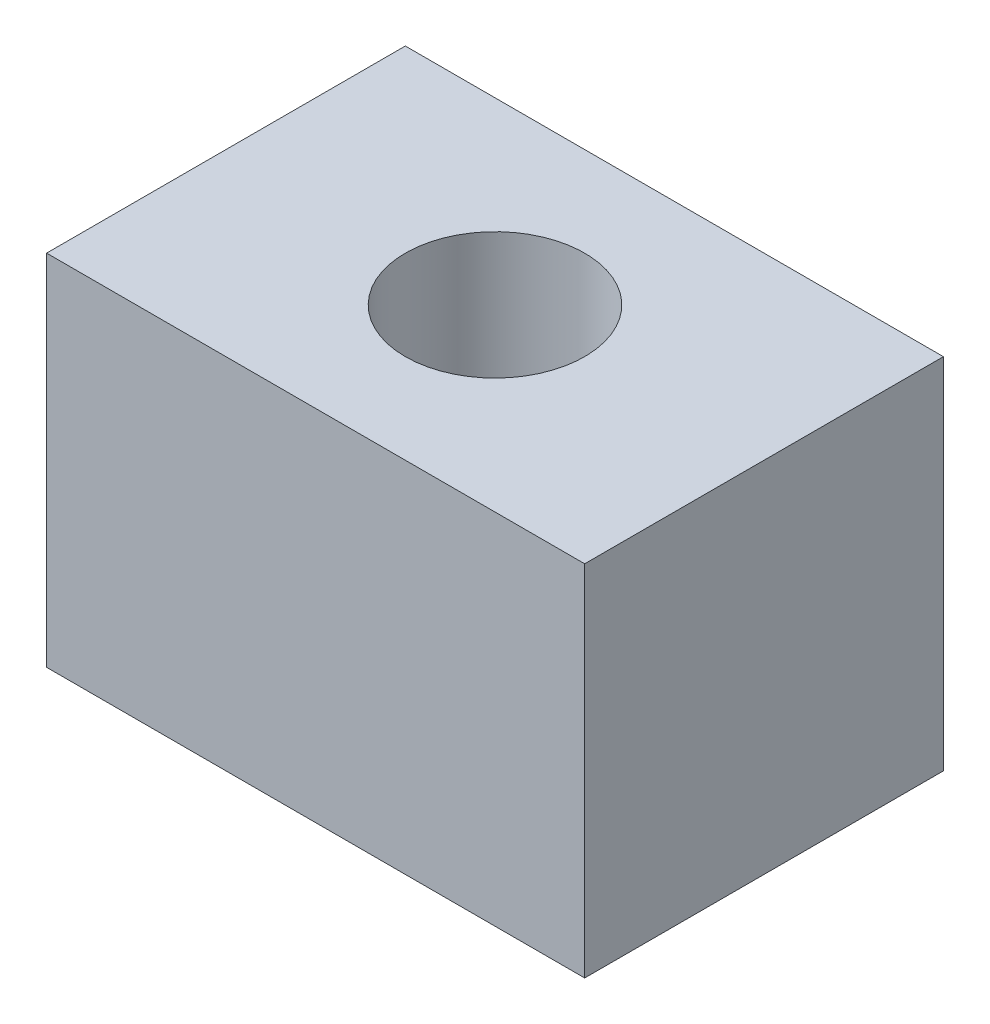
ISO-10303-21;
HEADER;
FILE_DESCRIPTION(('STEP AP214'),'2;1');
FILE_NAME('part.step','',(''),(''),'','','');
FILE_SCHEMA(('AUTOMOTIVE_DESIGN { 1 0 10303 214 1 1 1 1 }'));
ENDSEC;
DATA;
#1=APPLICATION_CONTEXT('core data for automotive mechanical design processes');
#2=APPLICATION_PROTOCOL_DEFINITION('international standard','automotive_design',2000,#1);
#3=PRODUCT_CONTEXT('',#1,'mechanical');
#4=PRODUCT('Part','Part','',(#3));
#5=PRODUCT_RELATED_PRODUCT_CATEGORY('part','',(#4));
#6=PRODUCT_DEFINITION_FORMATION('','',#4);
#7=PRODUCT_DEFINITION_CONTEXT('part definition',#1,'design');
#8=PRODUCT_DEFINITION('design','',#6,#7);
#9=PRODUCT_DEFINITION_SHAPE('','',#8);
#10=(LENGTH_UNIT() NAMED_UNIT(*) SI_UNIT(.MILLI.,.METRE.));
#11=(NAMED_UNIT(*) PLANE_ANGLE_UNIT() SI_UNIT($,.RADIAN.));
#12=(NAMED_UNIT(*) SI_UNIT($,.STERADIAN.) SOLID_ANGLE_UNIT());
#13=UNCERTAINTY_MEASURE_WITH_UNIT(LENGTH_MEASURE(1.E-05),#10,'distance_accuracy_value','');
#14=(GEOMETRIC_REPRESENTATION_CONTEXT(3) GLOBAL_UNCERTAINTY_ASSIGNED_CONTEXT((#13)) GLOBAL_UNIT_ASSIGNED_CONTEXT((#10,
#11,#12)) REPRESENTATION_CONTEXT('',''));
#15=CARTESIAN_POINT('',(0.,0.,0.));
#16=DIRECTION('',(0.,0.,1.));
#17=DIRECTION('',(1.,0.,0.));
#18=AXIS2_PLACEMENT_3D('',#15,#16,#17);
#19=CARTESIAN_POINT('',(0.,6.,0.));
#20=DIRECTION('',(0.,-1.,0.));
#21=DIRECTION('',(0.,0.,-1.));
#22=AXIS2_PLACEMENT_3D('',#19,#20,#21);
#23=PLANE('',#22);
#24=DIRECTION('',(0.,0.,-1.));
#25=VECTOR('',#24,1.);
#26=CARTESIAN_POINT('',(4.5,6.,3.));
#27=LINE('',#26,#25);
#28=CARTESIAN_POINT('',(4.5,6.,3.));
#29=VERTEX_POINT('',#28);
#30=CARTESIAN_POINT('',(4.5,6.,-3.));
#31=VERTEX_POINT('',#30);
#32=EDGE_CURVE('E85',#29,#31,#27,.T.);
#33=ORIENTED_EDGE('',*,*,#32,.T.);
#34=DIRECTION('',(-1.,0.,0.));
#35=VECTOR('',#34,1.);
#36=CARTESIAN_POINT('',(-4.5,6.,-3.));
#37=LINE('',#36,#35);
#38=CARTESIAN_POINT('',(-4.5,6.,-3.));
#39=VERTEX_POINT('',#38);
#40=EDGE_CURVE('E80',#31,#39,#37,.T.);
#41=ORIENTED_EDGE('',*,*,#40,.T.);
#42=DIRECTION('',(0.,0.,1.));
#43=VECTOR('',#42,1.);
#44=CARTESIAN_POINT('',(-4.5,6.,3.));
#45=LINE('',#44,#43);
#46=CARTESIAN_POINT('',(-4.5,6.,3.));
#47=VERTEX_POINT('',#46);
#48=EDGE_CURVE('E83',#39,#47,#45,.T.);
#49=ORIENTED_EDGE('',*,*,#48,.T.);
#50=DIRECTION('',(1.,0.,0.));
#51=VECTOR('',#50,1.);
#52=CARTESIAN_POINT('',(-4.5,6.,3.));
#53=LINE('',#52,#51);
#54=EDGE_CURVE('E50',#47,#29,#53,.T.);
#55=ORIENTED_EDGE('',*,*,#54,.T.);
#56=EDGE_LOOP('',(#33,#41,#49,#55));
#57=FACE_BOUND('',#56,.T.);
#58=CARTESIAN_POINT('',(0.,6.,0.));
#59=DIRECTION('',(0.,1.,0.));
#60=DIRECTION('',(0.,0.,1.));
#61=AXIS2_PLACEMENT_3D('',#58,#59,#60);
#62=CIRCLE('',#61,1.5);
#63=CARTESIAN_POINT('',(0.,6.,1.5));
#64=VERTEX_POINT('',#63);
#65=EDGE_CURVE('E100',#64,#64,#62,.T.);
#66=ORIENTED_EDGE('',*,*,#65,.F.);
#67=EDGE_LOOP('',(#66));
#68=FACE_BOUND('',#67,.T.);
#69=ADVANCED_FACE('F33',(#57,#68),#23,.F.);
#70=CARTESIAN_POINT('',(0.,0.,0.));
#71=DIRECTION('',(0.,-1.,0.));
#72=DIRECTION('',(0.,0.,-1.));
#73=AXIS2_PLACEMENT_3D('',#70,#71,#72);
#74=PLANE('',#73);
#75=DIRECTION('',(0.,0.,-1.));
#76=VECTOR('',#75,1.);
#77=CARTESIAN_POINT('',(4.5,0.,3.));
#78=LINE('',#77,#76);
#79=CARTESIAN_POINT('',(4.5,0.,3.));
#80=VERTEX_POINT('',#79);
#81=CARTESIAN_POINT('',(4.5,0.,-3.));
#82=VERTEX_POINT('',#81);
#83=EDGE_CURVE('E97',#80,#82,#78,.T.);
#84=ORIENTED_EDGE('',*,*,#83,.F.);
#85=DIRECTION('',(1.,0.,0.));
#86=VECTOR('',#85,1.);
#87=CARTESIAN_POINT('',(-4.5,0.,3.));
#88=LINE('',#87,#86);
#89=CARTESIAN_POINT('',(-4.5,0.,3.));
#90=VERTEX_POINT('',#89);
#91=EDGE_CURVE('E73',#90,#80,#88,.T.);
#92=ORIENTED_EDGE('',*,*,#91,.F.);
#93=DIRECTION('',(0.,0.,1.));
#94=VECTOR('',#93,1.);
#95=CARTESIAN_POINT('',(-4.5,0.,3.));
#96=LINE('',#95,#94);
#97=CARTESIAN_POINT('',(-4.5,0.,-3.));
#98=VERTEX_POINT('',#97);
#99=EDGE_CURVE('E67',#98,#90,#96,.T.);
#100=ORIENTED_EDGE('',*,*,#99,.F.);
#101=DIRECTION('',(-1.,0.,0.));
#102=VECTOR('',#101,1.);
#103=CARTESIAN_POINT('',(-4.5,0.,-3.));
#104=LINE('',#103,#102);
#105=EDGE_CURVE('E89',#82,#98,#104,.T.);
#106=ORIENTED_EDGE('',*,*,#105,.F.);
#107=EDGE_LOOP('',(#84,#92,#100,#106));
#108=FACE_BOUND('',#107,.T.);
#109=CARTESIAN_POINT('',(0.,0.,0.));
#110=DIRECTION('',(0.,1.,0.));
#111=DIRECTION('',(0.,0.,1.));
#112=AXIS2_PLACEMENT_3D('',#109,#110,#111);
#113=CIRCLE('',#112,1.5);
#114=CARTESIAN_POINT('',(0.,0.,1.5));
#115=VERTEX_POINT('',#114);
#116=EDGE_CURVE('E112',#115,#115,#113,.T.);
#117=ORIENTED_EDGE('',*,*,#116,.T.);
#118=EDGE_LOOP('',(#117));
#119=FACE_BOUND('',#118,.T.);
#120=ADVANCED_FACE('F108',(#108,#119),#74,.T.);
#121=CARTESIAN_POINT('',(4.5,6.,3.));
#122=DIRECTION('',(-1.,0.,0.));
#123=DIRECTION('',(0.,0.,1.));
#124=AXIS2_PLACEMENT_3D('',#121,#122,#123);
#125=PLANE('',#124);
#126=ORIENTED_EDGE('',*,*,#83,.T.);
#127=DIRECTION('',(0.,-1.,0.));
#128=VECTOR('',#127,1.);
#129=CARTESIAN_POINT('',(4.5,6.,-3.));
#130=LINE('',#129,#128);
#131=EDGE_CURVE('E11',#31,#82,#130,.T.);
#132=ORIENTED_EDGE('',*,*,#131,.F.);
#133=ORIENTED_EDGE('',*,*,#32,.F.);
#134=DIRECTION('',(0.,-1.,0.));
#135=VECTOR('',#134,1.);
#136=CARTESIAN_POINT('',(4.5,6.,3.));
#137=LINE('',#136,#135);
#138=EDGE_CURVE('E93',#29,#80,#137,.T.);
#139=ORIENTED_EDGE('',*,*,#138,.T.);
#140=EDGE_LOOP('',(#126,#132,#133,#139));
#141=FACE_BOUND('',#140,.T.);
#142=ADVANCED_FACE('F35',(#141),#125,.F.);
#143=CARTESIAN_POINT('',(-4.5,6.,-3.));
#144=DIRECTION('',(0.,0.,1.));
#145=DIRECTION('',(1.,0.,0.));
#146=AXIS2_PLACEMENT_3D('',#143,#144,#145);
#147=PLANE('',#146);
#148=ORIENTED_EDGE('',*,*,#105,.T.);
#149=DIRECTION('',(0.,-1.,0.));
#150=VECTOR('',#149,1.);
#151=CARTESIAN_POINT('',(-4.5,6.,-3.));
#152=LINE('',#151,#150);
#153=EDGE_CURVE('E42',#39,#98,#152,.T.);
#154=ORIENTED_EDGE('',*,*,#153,.F.);
#155=ORIENTED_EDGE('',*,*,#40,.F.);
#156=ORIENTED_EDGE('',*,*,#131,.T.);
#157=EDGE_LOOP('',(#148,#154,#155,#156));
#158=FACE_BOUND('',#157,.T.);
#159=ADVANCED_FACE('F88',(#158),#147,.F.);
#160=CARTESIAN_POINT('',(-4.5,6.,3.));
#161=DIRECTION('',(1.,0.,0.));
#162=DIRECTION('',(0.,0.,-1.));
#163=AXIS2_PLACEMENT_3D('',#160,#161,#162);
#164=PLANE('',#163);
#165=ORIENTED_EDGE('',*,*,#99,.T.);
#166=DIRECTION('',(0.,-1.,0.));
#167=VECTOR('',#166,1.);
#168=CARTESIAN_POINT('',(-4.5,6.,3.));
#169=LINE('',#168,#167);
#170=EDGE_CURVE('E90',#47,#90,#169,.T.);
#171=ORIENTED_EDGE('',*,*,#170,.F.);
#172=ORIENTED_EDGE('',*,*,#48,.F.);
#173=ORIENTED_EDGE('',*,*,#153,.T.);
#174=EDGE_LOOP('',(#165,#171,#172,#173));
#175=FACE_BOUND('',#174,.T.);
#176=ADVANCED_FACE('F91',(#175),#164,.F.);
#177=CARTESIAN_POINT('',(-4.5,6.,3.));
#178=DIRECTION('',(0.,0.,-1.));
#179=DIRECTION('',(-1.,0.,0.));
#180=AXIS2_PLACEMENT_3D('',#177,#178,#179);
#181=PLANE('',#180);
#182=ORIENTED_EDGE('',*,*,#91,.T.);
#183=ORIENTED_EDGE('',*,*,#138,.F.);
#184=ORIENTED_EDGE('',*,*,#54,.F.);
#185=ORIENTED_EDGE('',*,*,#170,.T.);
#186=EDGE_LOOP('',(#182,#183,#184,#185));
#187=FACE_BOUND('',#186,.T.);
#188=ADVANCED_FACE('F105',(#187),#181,.F.);
#189=CARTESIAN_POINT('',(0.,6.,0.));
#190=DIRECTION('',(0.,-1.,0.));
#191=DIRECTION('',(0.,0.,-1.));
#192=AXIS2_PLACEMENT_3D('',#189,#190,#191);
#193=CYLINDRICAL_SURFACE('',#192,1.5);
#194=ORIENTED_EDGE('',*,*,#65,.T.);
#195=EDGE_LOOP('',(#194));
#196=FACE_BOUND('',#195,.T.);
#197=ORIENTED_EDGE('',*,*,#116,.F.);
#198=EDGE_LOOP('',(#197));
#199=FACE_BOUND('',#198,.T.);
#200=ADVANCED_FACE('F118',(#196,#199),#193,.F.);
#201=CLOSED_SHELL('',(#69,#120,#142,#159,#176,#188,#200));
#202=MANIFOLD_SOLID_BREP('B2',#201);
#203=ADVANCED_BREP_SHAPE_REPRESENTATION('',(#18,#202),#14);
#204=SHAPE_DEFINITION_REPRESENTATION(#9,#203);
ENDSEC;
END-ISO-10303-21;
